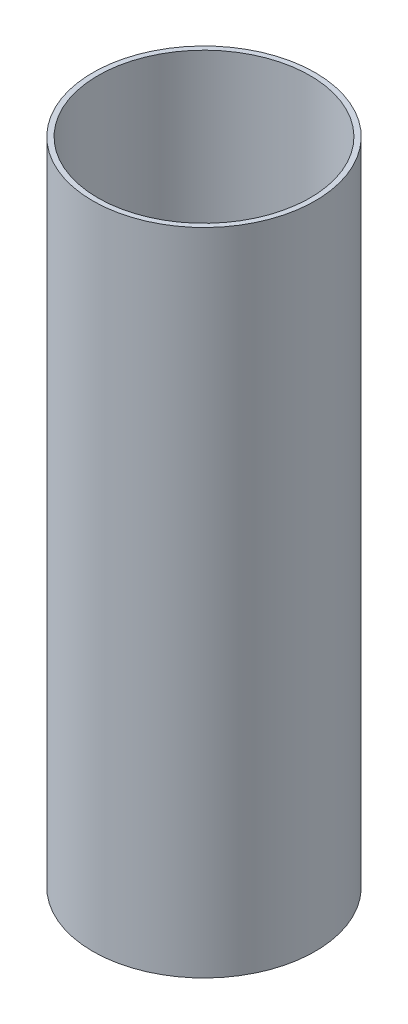
ISO-10303-21;
HEADER;
FILE_DESCRIPTION(('STEP AP214'),'2;1');
FILE_NAME('part.step','',(''),(''),'','','');
FILE_SCHEMA(('AUTOMOTIVE_DESIGN { 1 0 10303 214 1 1 1 1 }'));
ENDSEC;
DATA;
#1=APPLICATION_CONTEXT('core data for automotive mechanical design processes');
#2=APPLICATION_PROTOCOL_DEFINITION('international standard','automotive_design',2000,#1);
#3=PRODUCT_CONTEXT('',#1,'mechanical');
#4=PRODUCT('Part','Part','',(#3));
#5=PRODUCT_RELATED_PRODUCT_CATEGORY('part','',(#4));
#6=PRODUCT_DEFINITION_FORMATION('','',#4);
#7=PRODUCT_DEFINITION_CONTEXT('part definition',#1,'design');
#8=PRODUCT_DEFINITION('design','',#6,#7);
#9=PRODUCT_DEFINITION_SHAPE('','',#8);
#10=(LENGTH_UNIT() NAMED_UNIT(*) SI_UNIT(.MILLI.,.METRE.));
#11=(NAMED_UNIT(*) PLANE_ANGLE_UNIT() SI_UNIT($,.RADIAN.));
#12=(NAMED_UNIT(*) SI_UNIT($,.STERADIAN.) SOLID_ANGLE_UNIT());
#13=UNCERTAINTY_MEASURE_WITH_UNIT(LENGTH_MEASURE(1.E-05),#10,'distance_accuracy_value','');
#14=(GEOMETRIC_REPRESENTATION_CONTEXT(3) GLOBAL_UNCERTAINTY_ASSIGNED_CONTEXT((#13)) GLOBAL_UNIT_ASSIGNED_CONTEXT((#10,
#11,#12)) REPRESENTATION_CONTEXT('',''));
#15=CARTESIAN_POINT('',(0.,0.,0.));
#16=DIRECTION('',(0.,0.,1.));
#17=DIRECTION('',(1.,0.,0.));
#18=AXIS2_PLACEMENT_3D('',#15,#16,#17);
#19=CARTESIAN_POINT('',(0.,190.,0.));
#20=DIRECTION('',(0.,1.,0.));
#21=DIRECTION('',(0.,0.,1.));
#22=AXIS2_PLACEMENT_3D('',#19,#20,#21);
#23=PLANE('',#22);
#24=CARTESIAN_POINT('',(0.,190.,0.));
#25=DIRECTION('',(0.,1.,0.));
#26=DIRECTION('',(0.,0.,1.));
#27=AXIS2_PLACEMENT_3D('',#24,#25,#26);
#28=CIRCLE('',#27,32.5);
#29=CARTESIAN_POINT('',(0.,190.,32.5));
#30=VERTEX_POINT('',#29);
#31=EDGE_CURVE('E11',#30,#30,#28,.T.);
#32=ORIENTED_EDGE('',*,*,#31,.T.);
#33=EDGE_LOOP('',(#32));
#34=FACE_BOUND('',#33,.T.);
#35=CARTESIAN_POINT('',(0.,190.,0.));
#36=DIRECTION('',(0.,1.,0.));
#37=DIRECTION('',(0.,0.,1.));
#38=AXIS2_PLACEMENT_3D('',#35,#36,#37);
#39=CIRCLE('',#38,31.);
#40=CARTESIAN_POINT('',(0.,190.,31.));
#41=VERTEX_POINT('',#40);
#42=EDGE_CURVE('E48',#41,#41,#39,.T.);
#43=ORIENTED_EDGE('',*,*,#42,.F.);
#44=EDGE_LOOP('',(#43));
#45=FACE_BOUND('',#44,.T.);
#46=ADVANCED_FACE('F37',(#34,#45),#23,.T.);
#47=CARTESIAN_POINT('',(0.,0.,0.));
#48=DIRECTION('',(0.,1.,0.));
#49=DIRECTION('',(0.,0.,1.));
#50=AXIS2_PLACEMENT_3D('',#47,#48,#49);
#51=PLANE('',#50);
#52=CARTESIAN_POINT('',(0.,0.,0.));
#53=DIRECTION('',(0.,1.,0.));
#54=DIRECTION('',(0.,0.,1.));
#55=AXIS2_PLACEMENT_3D('',#52,#53,#54);
#56=CIRCLE('',#55,32.5);
#57=CARTESIAN_POINT('',(0.,0.,32.5));
#58=VERTEX_POINT('',#57);
#59=EDGE_CURVE('E41',#58,#58,#56,.T.);
#60=ORIENTED_EDGE('',*,*,#59,.F.);
#61=EDGE_LOOP('',(#60));
#62=FACE_BOUND('',#61,.T.);
#63=CARTESIAN_POINT('',(0.,0.,0.));
#64=DIRECTION('',(0.,1.,0.));
#65=DIRECTION('',(0.,0.,1.));
#66=AXIS2_PLACEMENT_3D('',#63,#64,#65);
#67=CIRCLE('',#66,31.);
#68=CARTESIAN_POINT('',(0.,0.,31.));
#69=VERTEX_POINT('',#68);
#70=EDGE_CURVE('E50',#69,#69,#67,.T.);
#71=ORIENTED_EDGE('',*,*,#70,.T.);
#72=EDGE_LOOP('',(#71));
#73=FACE_BOUND('',#72,.T.);
#74=ADVANCED_FACE('F60',(#62,#73),#51,.F.);
#75=CARTESIAN_POINT('',(0.,190.,0.));
#76=DIRECTION('',(0.,-1.,0.));
#77=DIRECTION('',(0.,0.,-1.));
#78=AXIS2_PLACEMENT_3D('',#75,#76,#77);
#79=CYLINDRICAL_SURFACE('',#78,32.5);
#80=ORIENTED_EDGE('',*,*,#31,.F.);
#81=EDGE_LOOP('',(#80));
#82=FACE_BOUND('',#81,.T.);
#83=ORIENTED_EDGE('',*,*,#59,.T.);
#84=EDGE_LOOP('',(#83));
#85=FACE_BOUND('',#84,.T.);
#86=ADVANCED_FACE('F39',(#82,#85),#79,.T.);
#87=CARTESIAN_POINT('',(0.,190.,0.));
#88=DIRECTION('',(0.,-1.,0.));
#89=DIRECTION('',(0.,0.,-1.));
#90=AXIS2_PLACEMENT_3D('',#87,#88,#89);
#91=CYLINDRICAL_SURFACE('',#90,31.);
#92=ORIENTED_EDGE('',*,*,#42,.T.);
#93=EDGE_LOOP('',(#92));
#94=FACE_BOUND('',#93,.T.);
#95=ORIENTED_EDGE('',*,*,#70,.F.);
#96=EDGE_LOOP('',(#95));
#97=FACE_BOUND('',#96,.T.);
#98=ADVANCED_FACE('F56',(#94,#97),#91,.F.);
#99=CLOSED_SHELL('',(#46,#74,#86,#98));
#100=MANIFOLD_SOLID_BREP('B2',#99);
#101=ADVANCED_BREP_SHAPE_REPRESENTATION('',(#18,#100),#14);
#102=SHAPE_DEFINITION_REPRESENTATION(#9,#101);
ENDSEC;
END-ISO-10303-21;
